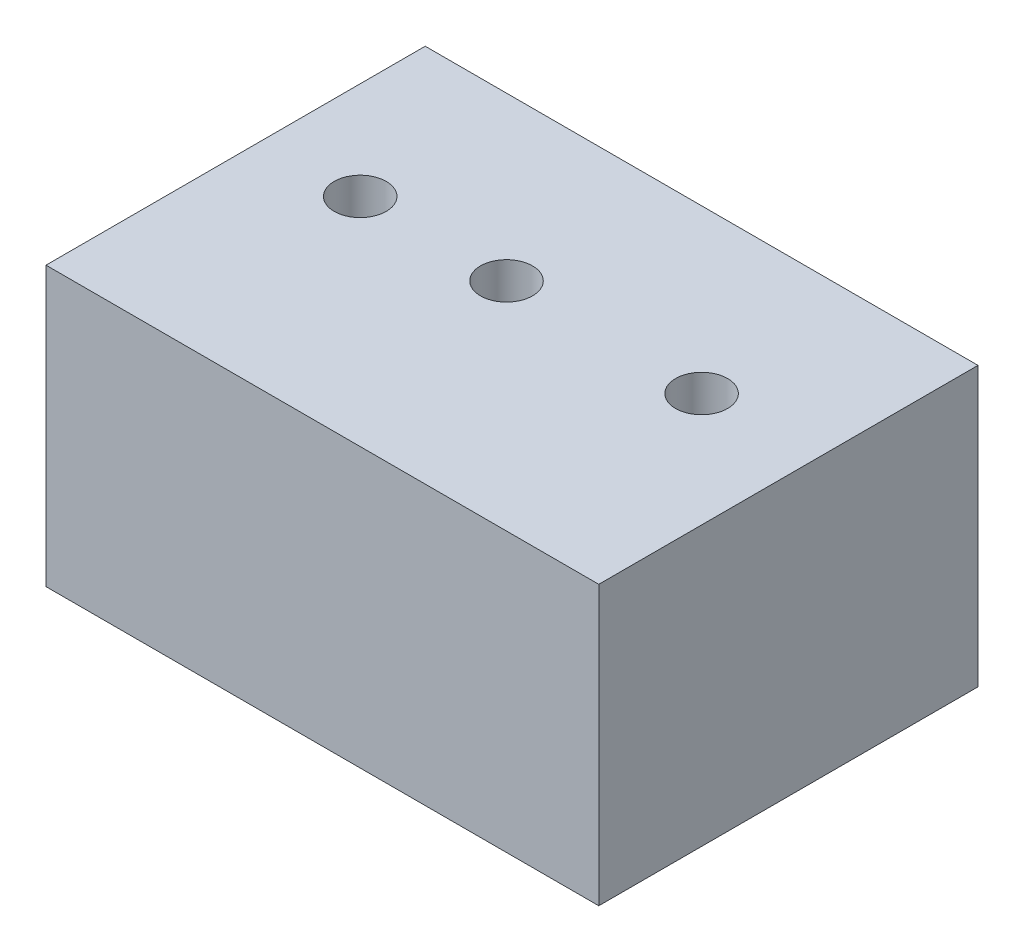
ISO-10303-21;
HEADER;
FILE_DESCRIPTION(('STEP AP214'),'2;1');
FILE_NAME('part.step','',(''),(''),'','','');
FILE_SCHEMA(('AUTOMOTIVE_DESIGN { 1 0 10303 214 1 1 1 1 }'));
ENDSEC;
DATA;
#1=APPLICATION_CONTEXT('core data for automotive mechanical design processes');
#2=APPLICATION_PROTOCOL_DEFINITION('international standard','automotive_design',2000,#1);
#3=PRODUCT_CONTEXT('',#1,'mechanical');
#4=PRODUCT('Part','Part','',(#3));
#5=PRODUCT_RELATED_PRODUCT_CATEGORY('part','',(#4));
#6=PRODUCT_DEFINITION_FORMATION('','',#4);
#7=PRODUCT_DEFINITION_CONTEXT('part definition',#1,'design');
#8=PRODUCT_DEFINITION('design','',#6,#7);
#9=PRODUCT_DEFINITION_SHAPE('','',#8);
#10=(LENGTH_UNIT() NAMED_UNIT(*) SI_UNIT(.MILLI.,.METRE.));
#11=(NAMED_UNIT(*) PLANE_ANGLE_UNIT() SI_UNIT($,.RADIAN.));
#12=(NAMED_UNIT(*) SI_UNIT($,.STERADIAN.) SOLID_ANGLE_UNIT());
#13=UNCERTAINTY_MEASURE_WITH_UNIT(LENGTH_MEASURE(1.E-05),#10,'distance_accuracy_value','');
#14=(GEOMETRIC_REPRESENTATION_CONTEXT(3) GLOBAL_UNCERTAINTY_ASSIGNED_CONTEXT((#13)) GLOBAL_UNIT_ASSIGNED_CONTEXT((#10,
#11,#12)) REPRESENTATION_CONTEXT('',''));
#15=CARTESIAN_POINT('',(0.,0.,0.));
#16=DIRECTION('',(0.,0.,1.));
#17=DIRECTION('',(1.,0.,0.));
#18=AXIS2_PLACEMENT_3D('',#15,#16,#17);
#19=CARTESIAN_POINT('',(0.,17.125,0.));
#20=DIRECTION('',(0.,-1.,0.));
#21=DIRECTION('',(0.,0.,-1.));
#22=AXIS2_PLACEMENT_3D('',#19,#20,#21);
#23=PLANE('',#22);
#24=DIRECTION('',(0.,0.,1.));
#25=VECTOR('',#24,1.);
#26=CARTESIAN_POINT('',(0.,17.125,0.));
#27=LINE('',#26,#25);
#28=CARTESIAN_POINT('',(0.,17.125,-23.325));
#29=VERTEX_POINT('',#28);
#30=CARTESIAN_POINT('',(0.,17.125,0.));
#31=VERTEX_POINT('',#30);
#32=EDGE_CURVE('E98',#29,#31,#27,.T.);
#33=ORIENTED_EDGE('',*,*,#32,.T.);
#34=DIRECTION('',(1.,0.,0.));
#35=VECTOR('',#34,1.);
#36=CARTESIAN_POINT('',(0.,17.125,0.));
#37=LINE('',#36,#35);
#38=CARTESIAN_POINT('',(34.,17.125,0.));
#39=VERTEX_POINT('',#38);
#40=EDGE_CURVE('E93',#31,#39,#37,.T.);
#41=ORIENTED_EDGE('',*,*,#40,.T.);
#42=DIRECTION('',(0.,0.,-1.));
#43=VECTOR('',#42,1.);
#44=CARTESIAN_POINT('',(34.,17.125,0.));
#45=LINE('',#44,#43);
#46=CARTESIAN_POINT('',(34.,17.125,-23.325));
#47=VERTEX_POINT('',#46);
#48=EDGE_CURVE('E96',#39,#47,#45,.T.);
#49=ORIENTED_EDGE('',*,*,#48,.T.);
#50=DIRECTION('',(-1.,0.,0.));
#51=VECTOR('',#50,1.);
#52=CARTESIAN_POINT('',(0.,17.125,-23.325));
#53=LINE('',#52,#51);
#54=EDGE_CURVE('E63',#47,#29,#53,.T.);
#55=ORIENTED_EDGE('',*,*,#54,.T.);
#56=EDGE_LOOP('',(#33,#41,#49,#55));
#57=FACE_BOUND('',#56,.T.);
#58=CARTESIAN_POINT('',(6.,17.125,-13.325));
#59=DIRECTION('',(0.,1.,0.));
#60=DIRECTION('',(0.,0.,1.));
#61=AXIS2_PLACEMENT_3D('',#58,#59,#60);
#62=CIRCLE('',#61,1.6);
#63=CARTESIAN_POINT('',(6.,17.125,-11.725));
#64=VERTEX_POINT('',#63);
#65=EDGE_CURVE('E118',#64,#64,#62,.T.);
#66=ORIENTED_EDGE('',*,*,#65,.F.);
#67=EDGE_LOOP('',(#66));
#68=FACE_BOUND('',#67,.T.);
#69=CARTESIAN_POINT('',(15.,17.125,-13.325));
#70=DIRECTION('',(0.,1.,0.));
#71=DIRECTION('',(0.,0.,1.));
#72=AXIS2_PLACEMENT_3D('',#69,#70,#71);
#73=CIRCLE('',#72,1.6);
#74=CARTESIAN_POINT('',(15.,17.125,-11.725));
#75=VERTEX_POINT('',#74);
#76=EDGE_CURVE('E140',#75,#75,#73,.T.);
#77=ORIENTED_EDGE('',*,*,#76,.F.);
#78=EDGE_LOOP('',(#77));
#79=FACE_BOUND('',#78,.T.);
#80=CARTESIAN_POINT('',(27.,17.125,-13.325));
#81=DIRECTION('',(0.,1.,0.));
#82=DIRECTION('',(0.,0.,1.));
#83=AXIS2_PLACEMENT_3D('',#80,#81,#82);
#84=CIRCLE('',#83,1.6);
#85=CARTESIAN_POINT('',(27.,17.125,-11.725));
#86=VERTEX_POINT('',#85);
#87=EDGE_CURVE('E148',#86,#86,#84,.T.);
#88=ORIENTED_EDGE('',*,*,#87,.F.);
#89=EDGE_LOOP('',(#88));
#90=FACE_BOUND('',#89,.T.);
#91=ADVANCED_FACE('F45',(#57,#68,#79,#90),#23,.F.);
#92=CARTESIAN_POINT('',(0.,0.,0.));
#93=DIRECTION('',(0.,-1.,0.));
#94=DIRECTION('',(0.,0.,-1.));
#95=AXIS2_PLACEMENT_3D('',#92,#93,#94);
#96=PLANE('',#95);
#97=CARTESIAN_POINT('',(15.,0.,-13.325));
#98=DIRECTION('',(0.,1.,0.));
#99=DIRECTION('',(0.,0.,1.));
#100=AXIS2_PLACEMENT_3D('',#97,#98,#99);
#101=CIRCLE('',#100,1.6);
#102=CARTESIAN_POINT('',(15.,0.,-11.725));
#103=VERTEX_POINT('',#102);
#104=EDGE_CURVE('E144',#103,#103,#101,.T.);
#105=ORIENTED_EDGE('',*,*,#104,.T.);
#106=EDGE_LOOP('',(#105));
#107=FACE_BOUND('',#106,.T.);
#108=DIRECTION('',(0.,0.,1.));
#109=VECTOR('',#108,1.);
#110=CARTESIAN_POINT('',(0.,0.,0.));
#111=LINE('',#110,#109);
#112=CARTESIAN_POINT('',(0.,0.,-23.325));
#113=VERTEX_POINT('',#112);
#114=CARTESIAN_POINT('',(0.,0.,0.));
#115=VERTEX_POINT('',#114);
#116=EDGE_CURVE('E114',#113,#115,#111,.T.);
#117=ORIENTED_EDGE('',*,*,#116,.F.);
#118=DIRECTION('',(-1.,0.,0.));
#119=VECTOR('',#118,1.);
#120=CARTESIAN_POINT('',(0.,0.,-23.325));
#121=LINE('',#120,#119);
#122=CARTESIAN_POINT('',(34.,0.,-23.325));
#123=VERTEX_POINT('',#122);
#124=EDGE_CURVE('E86',#123,#113,#121,.T.);
#125=ORIENTED_EDGE('',*,*,#124,.F.);
#126=DIRECTION('',(0.,0.,-1.));
#127=VECTOR('',#126,1.);
#128=CARTESIAN_POINT('',(34.,0.,0.));
#129=LINE('',#128,#127);
#130=CARTESIAN_POINT('',(34.,0.,0.));
#131=VERTEX_POINT('',#130);
#132=EDGE_CURVE('E80',#131,#123,#129,.T.);
#133=ORIENTED_EDGE('',*,*,#132,.F.);
#134=DIRECTION('',(1.,0.,0.));
#135=VECTOR('',#134,1.);
#136=CARTESIAN_POINT('',(0.,0.,0.));
#137=LINE('',#136,#135);
#138=EDGE_CURVE('E103',#115,#131,#137,.T.);
#139=ORIENTED_EDGE('',*,*,#138,.F.);
#140=EDGE_LOOP('',(#117,#125,#133,#139));
#141=FACE_BOUND('',#140,.T.);
#142=CARTESIAN_POINT('',(6.,0.,-13.325));
#143=DIRECTION('',(0.,1.,0.));
#144=DIRECTION('',(0.,0.,1.));
#145=AXIS2_PLACEMENT_3D('',#142,#143,#144);
#146=CIRCLE('',#145,1.6);
#147=CARTESIAN_POINT('',(6.,0.,-11.725));
#148=VERTEX_POINT('',#147);
#149=EDGE_CURVE('E136',#148,#148,#146,.T.);
#150=ORIENTED_EDGE('',*,*,#149,.T.);
#151=EDGE_LOOP('',(#150));
#152=FACE_BOUND('',#151,.T.);
#153=CARTESIAN_POINT('',(27.,0.,-13.325));
#154=DIRECTION('',(0.,1.,0.));
#155=DIRECTION('',(0.,0.,1.));
#156=AXIS2_PLACEMENT_3D('',#153,#154,#155);
#157=CIRCLE('',#156,1.6);
#158=CARTESIAN_POINT('',(27.,0.,-11.725));
#159=VERTEX_POINT('',#158);
#160=EDGE_CURVE('E152',#159,#159,#157,.T.);
#161=ORIENTED_EDGE('',*,*,#160,.T.);
#162=EDGE_LOOP('',(#161));
#163=FACE_BOUND('',#162,.T.);
#164=ADVANCED_FACE('F131',(#107,#141,#152,#163),#96,.T.);
#165=CARTESIAN_POINT('',(0.,17.125,0.));
#166=DIRECTION('',(1.,0.,0.));
#167=DIRECTION('',(0.,0.,-1.));
#168=AXIS2_PLACEMENT_3D('',#165,#166,#167);
#169=PLANE('',#168);
#170=ORIENTED_EDGE('',*,*,#116,.T.);
#171=DIRECTION('',(0.,-1.,0.));
#172=VECTOR('',#171,1.);
#173=CARTESIAN_POINT('',(0.,17.125,0.));
#174=LINE('',#173,#172);
#175=EDGE_CURVE('E11',#31,#115,#174,.T.);
#176=ORIENTED_EDGE('',*,*,#175,.F.);
#177=ORIENTED_EDGE('',*,*,#32,.F.);
#178=DIRECTION('',(0.,-1.,0.));
#179=VECTOR('',#178,1.);
#180=CARTESIAN_POINT('',(0.,17.125,-23.325));
#181=LINE('',#180,#179);
#182=EDGE_CURVE('E110',#29,#113,#181,.T.);
#183=ORIENTED_EDGE('',*,*,#182,.T.);
#184=EDGE_LOOP('',(#170,#176,#177,#183));
#185=FACE_BOUND('',#184,.T.);
#186=ADVANCED_FACE('F47',(#185),#169,.F.);
#187=CARTESIAN_POINT('',(0.,17.125,0.));
#188=DIRECTION('',(0.,0.,-1.));
#189=DIRECTION('',(-1.,0.,0.));
#190=AXIS2_PLACEMENT_3D('',#187,#188,#189);
#191=PLANE('',#190);
#192=ORIENTED_EDGE('',*,*,#138,.T.);
#193=DIRECTION('',(0.,-1.,0.));
#194=VECTOR('',#193,1.);
#195=CARTESIAN_POINT('',(34.,17.125,0.));
#196=LINE('',#195,#194);
#197=EDGE_CURVE('E55',#39,#131,#196,.T.);
#198=ORIENTED_EDGE('',*,*,#197,.F.);
#199=ORIENTED_EDGE('',*,*,#40,.F.);
#200=ORIENTED_EDGE('',*,*,#175,.T.);
#201=EDGE_LOOP('',(#192,#198,#199,#200));
#202=FACE_BOUND('',#201,.T.);
#203=ADVANCED_FACE('F102',(#202),#191,.F.);
#204=CARTESIAN_POINT('',(34.,17.125,0.));
#205=DIRECTION('',(-1.,0.,0.));
#206=DIRECTION('',(0.,0.,1.));
#207=AXIS2_PLACEMENT_3D('',#204,#205,#206);
#208=PLANE('',#207);
#209=ORIENTED_EDGE('',*,*,#132,.T.);
#210=DIRECTION('',(0.,-1.,0.));
#211=VECTOR('',#210,1.);
#212=CARTESIAN_POINT('',(34.,17.125,-23.325));
#213=LINE('',#212,#211);
#214=EDGE_CURVE('E105',#47,#123,#213,.T.);
#215=ORIENTED_EDGE('',*,*,#214,.F.);
#216=ORIENTED_EDGE('',*,*,#48,.F.);
#217=ORIENTED_EDGE('',*,*,#197,.T.);
#218=EDGE_LOOP('',(#209,#215,#216,#217));
#219=FACE_BOUND('',#218,.T.);
#220=ADVANCED_FACE('F106',(#219),#208,.F.);
#221=CARTESIAN_POINT('',(0.,17.125,-23.325));
#222=DIRECTION('',(0.,0.,1.));
#223=DIRECTION('',(1.,0.,0.));
#224=AXIS2_PLACEMENT_3D('',#221,#222,#223);
#225=PLANE('',#224);
#226=ORIENTED_EDGE('',*,*,#124,.T.);
#227=ORIENTED_EDGE('',*,*,#182,.F.);
#228=ORIENTED_EDGE('',*,*,#54,.F.);
#229=ORIENTED_EDGE('',*,*,#214,.T.);
#230=EDGE_LOOP('',(#226,#227,#228,#229));
#231=FACE_BOUND('',#230,.T.);
#232=ADVANCED_FACE('F128',(#231),#225,.F.);
#233=CARTESIAN_POINT('',(6.,17.125,-13.325));
#234=DIRECTION('',(0.,-1.,0.));
#235=DIRECTION('',(0.,0.,-1.));
#236=AXIS2_PLACEMENT_3D('',#233,#234,#235);
#237=CYLINDRICAL_SURFACE('',#236,1.6);
#238=ORIENTED_EDGE('',*,*,#65,.T.);
#239=EDGE_LOOP('',(#238));
#240=FACE_BOUND('',#239,.T.);
#241=ORIENTED_EDGE('',*,*,#149,.F.);
#242=EDGE_LOOP('',(#241));
#243=FACE_BOUND('',#242,.T.);
#244=ADVANCED_FACE('F171',(#240,#243),#237,.F.);
#245=CARTESIAN_POINT('',(15.,17.125,-13.325));
#246=DIRECTION('',(0.,-1.,0.));
#247=DIRECTION('',(0.,0.,-1.));
#248=AXIS2_PLACEMENT_3D('',#245,#246,#247);
#249=CYLINDRICAL_SURFACE('',#248,1.6);
#250=ORIENTED_EDGE('',*,*,#76,.T.);
#251=EDGE_LOOP('',(#250));
#252=FACE_BOUND('',#251,.T.);
#253=ORIENTED_EDGE('',*,*,#104,.F.);
#254=EDGE_LOOP('',(#253));
#255=FACE_BOUND('',#254,.T.);
#256=ADVANCED_FACE('F216',(#252,#255),#249,.F.);
#257=CARTESIAN_POINT('',(27.,17.125,-13.325));
#258=DIRECTION('',(0.,-1.,0.));
#259=DIRECTION('',(0.,0.,-1.));
#260=AXIS2_PLACEMENT_3D('',#257,#258,#259);
#261=CYLINDRICAL_SURFACE('',#260,1.6);
#262=ORIENTED_EDGE('',*,*,#87,.T.);
#263=EDGE_LOOP('',(#262));
#264=FACE_BOUND('',#263,.T.);
#265=ORIENTED_EDGE('',*,*,#160,.F.);
#266=EDGE_LOOP('',(#265));
#267=FACE_BOUND('',#266,.T.);
#268=ADVANCED_FACE('F160',(#264,#267),#261,.F.);
#269=CLOSED_SHELL('',(#91,#164,#186,#203,#220,#232,#244,#256,#268));
#270=MANIFOLD_SOLID_BREP('B2',#269);
#271=ADVANCED_BREP_SHAPE_REPRESENTATION('',(#18,#270),#14);
#272=SHAPE_DEFINITION_REPRESENTATION(#9,#271);
ENDSEC;
END-ISO-10303-21;
